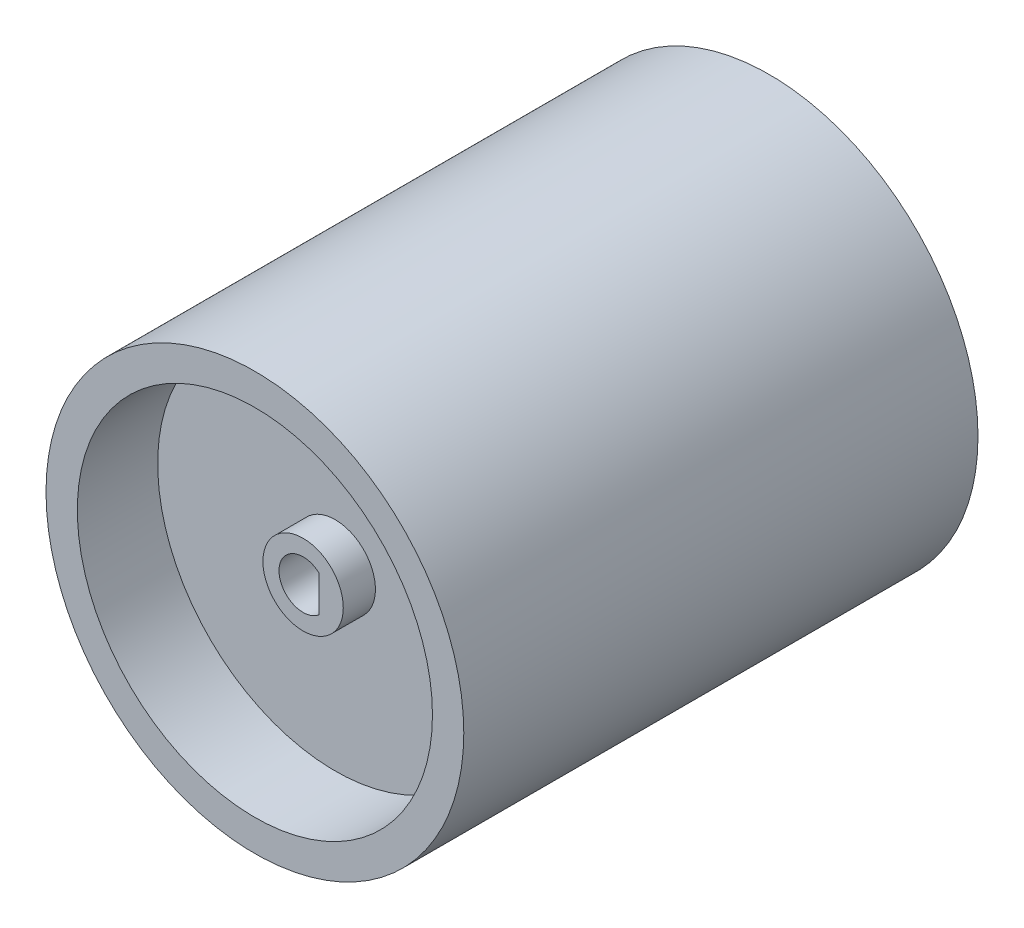
ISO-10303-21;
HEADER;
FILE_DESCRIPTION(('STEP AP214'),'2;1');
FILE_NAME('part.step','',(''),(''),'','','');
FILE_SCHEMA(('AUTOMOTIVE_DESIGN { 1 0 10303 214 1 1 1 1 }'));
ENDSEC;
DATA;
#1=APPLICATION_CONTEXT('core data for automotive mechanical design processes');
#2=APPLICATION_PROTOCOL_DEFINITION('international standard','automotive_design',2000,#1);
#3=PRODUCT_CONTEXT('',#1,'mechanical');
#4=PRODUCT('Part','Part','',(#3));
#5=PRODUCT_RELATED_PRODUCT_CATEGORY('part','',(#4));
#6=PRODUCT_DEFINITION_FORMATION('','',#4);
#7=PRODUCT_DEFINITION_CONTEXT('part definition',#1,'design');
#8=PRODUCT_DEFINITION('design','',#6,#7);
#9=PRODUCT_DEFINITION_SHAPE('','',#8);
#10=(LENGTH_UNIT() NAMED_UNIT(*) SI_UNIT(.MILLI.,.METRE.));
#11=(NAMED_UNIT(*) PLANE_ANGLE_UNIT() SI_UNIT($,.RADIAN.));
#12=(NAMED_UNIT(*) SI_UNIT($,.STERADIAN.) SOLID_ANGLE_UNIT());
#13=UNCERTAINTY_MEASURE_WITH_UNIT(LENGTH_MEASURE(1.E-05),#10,'distance_accuracy_value','');
#14=(GEOMETRIC_REPRESENTATION_CONTEXT(3) GLOBAL_UNCERTAINTY_ASSIGNED_CONTEXT((#13)) GLOBAL_UNIT_ASSIGNED_CONTEXT((#10,
#11,#12)) REPRESENTATION_CONTEXT('',''));
#15=CARTESIAN_POINT('',(0.,0.,0.));
#16=DIRECTION('',(0.,0.,1.));
#17=DIRECTION('',(1.,0.,0.));
#18=AXIS2_PLACEMENT_3D('',#15,#16,#17);
#19=CARTESIAN_POINT('',(0.,0.,7.));
#20=DIRECTION('',(0.,0.,-1.));
#21=DIRECTION('',(-1.,0.,0.));
#22=AXIS2_PLACEMENT_3D('',#19,#20,#21);
#23=CYLINDRICAL_SURFACE('',#22,13.);
#24=CARTESIAN_POINT('',(0.,0.,7.));
#25=DIRECTION('',(0.,0.,1.));
#26=DIRECTION('',(1.,0.,0.));
#27=AXIS2_PLACEMENT_3D('',#24,#25,#26);
#28=CIRCLE('',#27,13.);
#29=CARTESIAN_POINT('',(13.,0.,7.));
#30=VERTEX_POINT('',#29);
#31=EDGE_CURVE('E44',#30,#30,#28,.T.);
#32=ORIENTED_EDGE('',*,*,#31,.F.);
#33=EDGE_LOOP('',(#32));
#34=FACE_BOUND('',#33,.T.);
#35=CARTESIAN_POINT('',(0.,0.,-25.));
#36=DIRECTION('',(0.,0.,-1.));
#37=DIRECTION('',(-1.,0.,0.));
#38=AXIS2_PLACEMENT_3D('',#35,#36,#37);
#39=CIRCLE('',#38,13.);
#40=CARTESIAN_POINT('',(-13.,0.,-25.));
#41=VERTEX_POINT('',#40);
#42=EDGE_CURVE('E99',#41,#41,#39,.T.);
#43=ORIENTED_EDGE('',*,*,#42,.F.);
#44=EDGE_LOOP('',(#43));
#45=FACE_BOUND('',#44,.T.);
#46=ADVANCED_FACE('F36',(#34,#45),#23,.T.);
#47=CARTESIAN_POINT('',(0.,0.,0.));
#48=DIRECTION('',(0.,0.,-1.));
#49=DIRECTION('',(-1.,0.,0.));
#50=AXIS2_PLACEMENT_3D('',#47,#48,#49);
#51=CYLINDRICAL_SURFACE('',#50,11.05);
#52=CARTESIAN_POINT('',(0.,0.,0.));
#53=DIRECTION('',(0.,0.,-1.));
#54=DIRECTION('',(-1.,0.,0.));
#55=AXIS2_PLACEMENT_3D('',#52,#53,#54);
#56=CIRCLE('',#55,11.05);
#57=CARTESIAN_POINT('',(-11.05,0.,0.));
#58=VERTEX_POINT('',#57);
#59=EDGE_CURVE('E77',#58,#58,#56,.T.);
#60=ORIENTED_EDGE('',*,*,#59,.F.);
#61=EDGE_LOOP('',(#60));
#62=FACE_BOUND('',#61,.T.);
#63=CARTESIAN_POINT('',(0.,0.,-25.));
#64=DIRECTION('',(0.,0.,-1.));
#65=DIRECTION('',(-1.,0.,0.));
#66=AXIS2_PLACEMENT_3D('',#63,#64,#65);
#67=CIRCLE('',#66,11.05);
#68=CARTESIAN_POINT('',(-11.05,0.,-25.));
#69=VERTEX_POINT('',#68);
#70=EDGE_CURVE('E39',#69,#69,#67,.F.);
#71=ORIENTED_EDGE('',*,*,#70,.F.);
#72=EDGE_LOOP('',(#71));
#73=FACE_BOUND('',#72,.T.);
#74=ADVANCED_FACE('F96',(#62,#73),#51,.F.);
#75=CARTESIAN_POINT('',(0.,0.,0.));
#76=DIRECTION('',(0.,0.,1.));
#77=DIRECTION('',(1.,0.,0.));
#78=AXIS2_PLACEMENT_3D('',#75,#76,#77);
#79=PLANE('',#78);
#80=DIRECTION('',(0.,-1.,0.));
#81=VECTOR('',#80,1.);
#82=CARTESIAN_POINT('',(1.,-1.1180339887499,0.));
#83=LINE('',#82,#81);
#84=CARTESIAN_POINT('',(1.,1.1180339887499,0.));
#85=VERTEX_POINT('',#84);
#86=CARTESIAN_POINT('',(1.,-1.1180339887499,0.));
#87=VERTEX_POINT('',#86);
#88=EDGE_CURVE('E69',#85,#87,#83,.T.);
#89=ORIENTED_EDGE('',*,*,#88,.F.);
#90=CARTESIAN_POINT('',(0.,0.,0.));
#91=DIRECTION('',(0.,0.,-1.));
#92=DIRECTION('',(-1.,0.,0.));
#93=AXIS2_PLACEMENT_3D('',#90,#91,#92);
#94=CIRCLE('',#93,1.5);
#95=EDGE_CURVE('E51',#87,#85,#94,.T.);
#96=ORIENTED_EDGE('',*,*,#95,.F.);
#97=EDGE_LOOP('',(#89,#96));
#98=FACE_BOUND('',#97,.T.);
#99=ORIENTED_EDGE('',*,*,#59,.T.);
#100=EDGE_LOOP('',(#99));
#101=FACE_BOUND('',#100,.T.);
#102=ADVANCED_FACE('F126',(#98,#101),#79,.F.);
#103=CARTESIAN_POINT('',(0.,0.,2.));
#104=DIRECTION('',(0.,0.,-1.));
#105=DIRECTION('',(-1.,0.,0.));
#106=AXIS2_PLACEMENT_3D('',#103,#104,#105);
#107=PLANE('',#106);
#108=CARTESIAN_POINT('',(0.,0.,2.));
#109=DIRECTION('',(0.,0.,-1.));
#110=DIRECTION('',(-1.,0.,0.));
#111=AXIS2_PLACEMENT_3D('',#108,#109,#110);
#112=CIRCLE('',#111,2.5);
#113=CARTESIAN_POINT('',(-2.5,0.,2.));
#114=VERTEX_POINT('',#113);
#115=EDGE_CURVE('E11',#114,#114,#112,.F.);
#116=ORIENTED_EDGE('',*,*,#115,.F.);
#117=EDGE_LOOP('',(#116));
#118=FACE_BOUND('',#117,.T.);
#119=CARTESIAN_POINT('',(0.,0.,2.));
#120=DIRECTION('',(0.,0.,1.));
#121=DIRECTION('',(1.,0.,0.));
#122=AXIS2_PLACEMENT_3D('',#119,#120,#121);
#123=CIRCLE('',#122,11.05);
#124=CARTESIAN_POINT('',(11.05,0.,2.));
#125=VERTEX_POINT('',#124);
#126=EDGE_CURVE('E80',#125,#125,#123,.T.);
#127=ORIENTED_EDGE('',*,*,#126,.T.);
#128=EDGE_LOOP('',(#127));
#129=FACE_BOUND('',#128,.T.);
#130=ADVANCED_FACE('F109',(#118,#129),#107,.F.);
#131=CARTESIAN_POINT('',(0.,0.,7.));
#132=DIRECTION('',(0.,0.,1.));
#133=DIRECTION('',(1.,0.,0.));
#134=AXIS2_PLACEMENT_3D('',#131,#132,#133);
#135=PLANE('',#134);
#136=CARTESIAN_POINT('',(0.,0.,7.));
#137=DIRECTION('',(0.,0.,1.));
#138=DIRECTION('',(1.,0.,0.));
#139=AXIS2_PLACEMENT_3D('',#136,#137,#138);
#140=CIRCLE('',#139,11.05);
#141=CARTESIAN_POINT('',(11.05,0.,7.));
#142=VERTEX_POINT('',#141);
#143=EDGE_CURVE('E101',#142,#142,#140,.T.);
#144=ORIENTED_EDGE('',*,*,#143,.F.);
#145=EDGE_LOOP('',(#144));
#146=FACE_BOUND('',#145,.T.);
#147=ORIENTED_EDGE('',*,*,#31,.T.);
#148=EDGE_LOOP('',(#147));
#149=FACE_BOUND('',#148,.T.);
#150=ADVANCED_FACE('F92',(#146,#149),#135,.T.);
#151=CARTESIAN_POINT('',(0.,0.,7.001));
#152=DIRECTION('',(0.,0.,-1.));
#153=DIRECTION('',(-1.,0.,0.));
#154=AXIS2_PLACEMENT_3D('',#151,#152,#153);
#155=CYLINDRICAL_SURFACE('',#154,1.5);
#156=DIRECTION('',(0.,0.,-1.));
#157=VECTOR('',#156,1.);
#158=CARTESIAN_POINT('',(1.,1.1180339887499,7.001));
#159=LINE('',#158,#157);
#160=CARTESIAN_POINT('',(1.,1.11803398874989,4.));
#161=VERTEX_POINT('',#160);
#162=EDGE_CURVE('E61',#161,#85,#159,.T.);
#163=ORIENTED_EDGE('',*,*,#162,.F.);
#164=CARTESIAN_POINT('',(0.,0.,4.));
#165=DIRECTION('',(0.,0.,1.));
#166=DIRECTION('',(1.,0.,0.));
#167=AXIS2_PLACEMENT_3D('',#164,#165,#166);
#168=CIRCLE('',#167,1.5);
#169=CARTESIAN_POINT('',(1.,-1.1180339887499,4.));
#170=VERTEX_POINT('',#169);
#171=EDGE_CURVE('E65',#161,#170,#168,.T.);
#172=ORIENTED_EDGE('',*,*,#171,.T.);
#173=DIRECTION('',(0.,0.,-1.));
#174=VECTOR('',#173,1.);
#175=CARTESIAN_POINT('',(1.,-1.1180339887499,7.001));
#176=LINE('',#175,#174);
#177=EDGE_CURVE('E56',#170,#87,#176,.T.);
#178=ORIENTED_EDGE('',*,*,#177,.T.);
#179=ORIENTED_EDGE('',*,*,#95,.T.);
#180=EDGE_LOOP('',(#163,#172,#178,#179));
#181=FACE_BOUND('',#180,.T.);
#182=ADVANCED_FACE('F63',(#181),#155,.F.);
#183=CARTESIAN_POINT('',(1.,-1.1180339887499,7.001));
#184=DIRECTION('',(1.,0.,0.));
#185=DIRECTION('',(0.,0.,-1.));
#186=AXIS2_PLACEMENT_3D('',#183,#184,#185);
#187=PLANE('',#186);
#188=ORIENTED_EDGE('',*,*,#177,.F.);
#189=DIRECTION('',(0.,1.,0.));
#190=VECTOR('',#189,1.);
#191=CARTESIAN_POINT('',(1.,-1.1180339887499,4.));
#192=LINE('',#191,#190);
#193=EDGE_CURVE('E71',#170,#161,#192,.T.);
#194=ORIENTED_EDGE('',*,*,#193,.T.);
#195=ORIENTED_EDGE('',*,*,#162,.T.);
#196=ORIENTED_EDGE('',*,*,#88,.T.);
#197=EDGE_LOOP('',(#188,#194,#195,#196));
#198=FACE_BOUND('',#197,.T.);
#199=ADVANCED_FACE('F72',(#198),#187,.F.);
#200=CARTESIAN_POINT('',(0.,0.,4.));
#201=DIRECTION('',(0.,0.,1.));
#202=DIRECTION('',(1.,0.,0.));
#203=AXIS2_PLACEMENT_3D('',#200,#201,#202);
#204=PLANE('',#203);
#205=CARTESIAN_POINT('',(0.,0.,4.));
#206=DIRECTION('',(0.,0.,1.));
#207=DIRECTION('',(1.,0.,0.));
#208=AXIS2_PLACEMENT_3D('',#205,#206,#207);
#209=CIRCLE('',#208,2.5);
#210=CARTESIAN_POINT('',(2.5,0.,4.));
#211=VERTEX_POINT('',#210);
#212=EDGE_CURVE('E74',#211,#211,#209,.T.);
#213=ORIENTED_EDGE('',*,*,#212,.T.);
#214=EDGE_LOOP('',(#213));
#215=FACE_BOUND('',#214,.T.);
#216=ORIENTED_EDGE('',*,*,#193,.F.);
#217=ORIENTED_EDGE('',*,*,#171,.F.);
#218=EDGE_LOOP('',(#216,#217));
#219=FACE_BOUND('',#218,.T.);
#220=ADVANCED_FACE('F76',(#215,#219),#204,.T.);
#221=CARTESIAN_POINT('',(0.,0.,4.));
#222=DIRECTION('',(0.,0.,-1.));
#223=DIRECTION('',(-1.,0.,0.));
#224=AXIS2_PLACEMENT_3D('',#221,#222,#223);
#225=CYLINDRICAL_SURFACE('',#224,2.5);
#226=ORIENTED_EDGE('',*,*,#212,.F.);
#227=EDGE_LOOP('',(#226));
#228=FACE_BOUND('',#227,.T.);
#229=ORIENTED_EDGE('',*,*,#115,.T.);
#230=EDGE_LOOP('',(#229));
#231=FACE_BOUND('',#230,.T.);
#232=ADVANCED_FACE('F115',(#228,#231),#225,.T.);
#233=CARTESIAN_POINT('',(0.,0.,2.));
#234=DIRECTION('',(0.,0.,1.));
#235=DIRECTION('',(1.,0.,0.));
#236=AXIS2_PLACEMENT_3D('',#233,#234,#235);
#237=CYLINDRICAL_SURFACE('',#236,11.05);
#238=ORIENTED_EDGE('',*,*,#126,.F.);
#239=EDGE_LOOP('',(#238));
#240=FACE_BOUND('',#239,.T.);
#241=ORIENTED_EDGE('',*,*,#143,.T.);
#242=EDGE_LOOP('',(#241));
#243=FACE_BOUND('',#242,.T.);
#244=ADVANCED_FACE('F111',(#240,#243),#237,.F.);
#245=CARTESIAN_POINT('',(0.,0.,-25.));
#246=DIRECTION('',(0.,0.,-1.));
#247=DIRECTION('',(-1.,0.,0.));
#248=AXIS2_PLACEMENT_3D('',#245,#246,#247);
#249=PLANE('',#248);
#250=ORIENTED_EDGE('',*,*,#70,.T.);
#251=EDGE_LOOP('',(#250));
#252=FACE_BOUND('',#251,.T.);
#253=ORIENTED_EDGE('',*,*,#42,.T.);
#254=EDGE_LOOP('',(#253));
#255=FACE_BOUND('',#254,.T.);
#256=ADVANCED_FACE('F114',(#252,#255),#249,.T.);
#257=CLOSED_SHELL('',(#46,#74,#102,#130,#150,#182,#199,#220,#232,#244,#256));
#258=MANIFOLD_SOLID_BREP('B2',#257);
#259=ADVANCED_BREP_SHAPE_REPRESENTATION('',(#18,#258),#14);
#260=SHAPE_DEFINITION_REPRESENTATION(#9,#259);
ENDSEC;
END-ISO-10303-21;
